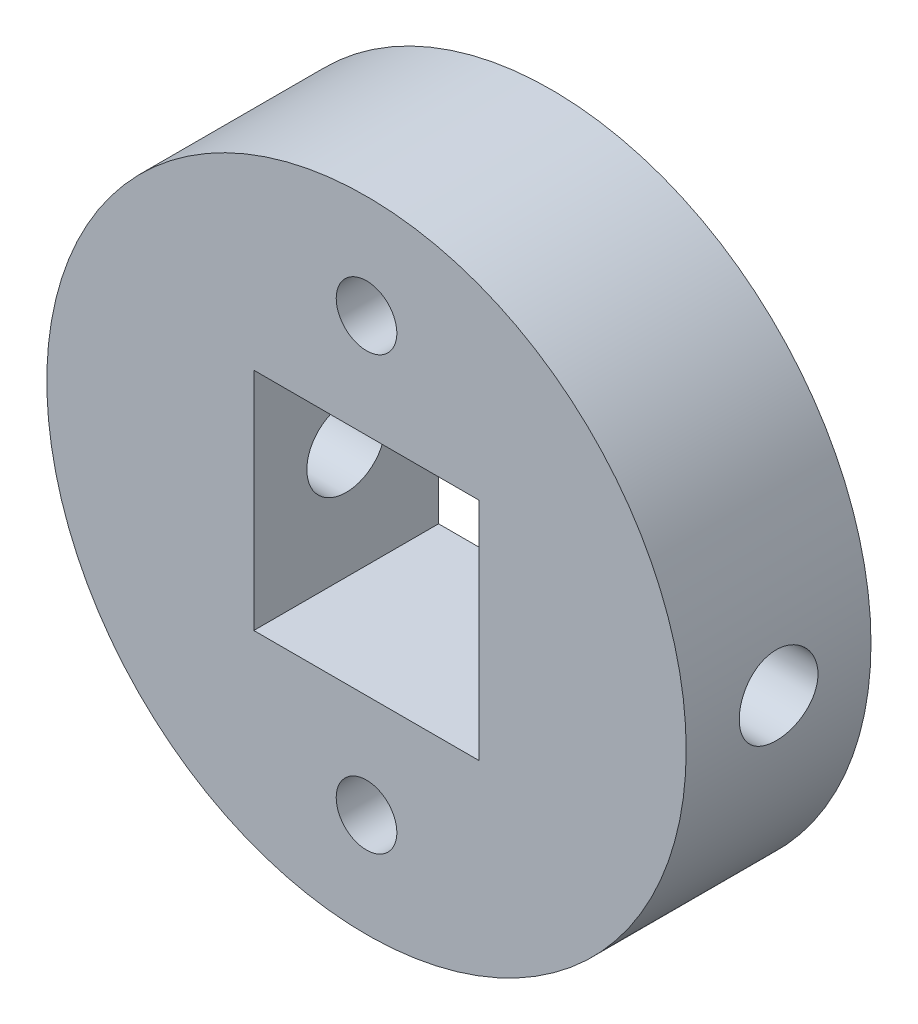
ISO-10303-21;
HEADER;
FILE_DESCRIPTION(('STEP AP214'),'2;1');
FILE_NAME('part.step','',(''),(''),'','','');
FILE_SCHEMA(('AUTOMOTIVE_DESIGN { 1 0 10303 214 1 1 1 1 }'));
ENDSEC;
DATA;
#1=APPLICATION_CONTEXT('core data for automotive mechanical design processes');
#2=APPLICATION_PROTOCOL_DEFINITION('international standard','automotive_design',2000,#1);
#3=PRODUCT_CONTEXT('',#1,'mechanical');
#4=PRODUCT('Part','Part','',(#3));
#5=PRODUCT_RELATED_PRODUCT_CATEGORY('part','',(#4));
#6=PRODUCT_DEFINITION_FORMATION('','',#4);
#7=PRODUCT_DEFINITION_CONTEXT('part definition',#1,'design');
#8=PRODUCT_DEFINITION('design','',#6,#7);
#9=PRODUCT_DEFINITION_SHAPE('','',#8);
#10=(LENGTH_UNIT() NAMED_UNIT(*) SI_UNIT(.MILLI.,.METRE.));
#11=(NAMED_UNIT(*) PLANE_ANGLE_UNIT() SI_UNIT($,.RADIAN.));
#12=(NAMED_UNIT(*) SI_UNIT($,.STERADIAN.) SOLID_ANGLE_UNIT());
#13=UNCERTAINTY_MEASURE_WITH_UNIT(LENGTH_MEASURE(1.E-05),#10,'distance_accuracy_value','');
#14=(GEOMETRIC_REPRESENTATION_CONTEXT(3) GLOBAL_UNCERTAINTY_ASSIGNED_CONTEXT((#13)) GLOBAL_UNIT_ASSIGNED_CONTEXT((#10,
#11,#12)) REPRESENTATION_CONTEXT('',''));
#15=CARTESIAN_POINT('',(0.,0.,0.));
#16=DIRECTION('',(0.,0.,1.));
#17=DIRECTION('',(1.,0.,0.));
#18=AXIS2_PLACEMENT_3D('',#15,#16,#17);
#19=CARTESIAN_POINT('',(0.,0.,6.35));
#20=DIRECTION('',(0.,0.,1.));
#21=DIRECTION('',(1.,0.,0.));
#22=AXIS2_PLACEMENT_3D('',#19,#20,#21);
#23=PLANE('',#22);
#24=CARTESIAN_POINT('',(0.,-7.4295,6.35));
#25=DIRECTION('',(0.,0.,-1.));
#26=DIRECTION('',(-1.,0.,0.));
#27=AXIS2_PLACEMENT_3D('',#24,#25,#26);
#28=CIRCLE('',#27,1.0414);
#29=CARTESIAN_POINT('',(-1.0414,-7.4295,6.35));
#30=VERTEX_POINT('',#29);
#31=EDGE_CURVE('E188',#30,#30,#28,.T.);
#32=ORIENTED_EDGE('',*,*,#31,.T.);
#33=EDGE_LOOP('',(#32));
#34=FACE_BOUND('',#33,.T.);
#35=CARTESIAN_POINT('',(0.,7.4295,6.35));
#36=DIRECTION('',(0.,0.,-1.));
#37=DIRECTION('',(-1.,0.,0.));
#38=AXIS2_PLACEMENT_3D('',#35,#36,#37);
#39=CIRCLE('',#38,1.0414);
#40=CARTESIAN_POINT('',(-1.0414,7.4295,6.35));
#41=VERTEX_POINT('',#40);
#42=EDGE_CURVE('E187',#41,#41,#39,.T.);
#43=ORIENTED_EDGE('',*,*,#42,.T.);
#44=EDGE_LOOP('',(#43));
#45=FACE_BOUND('',#44,.T.);
#46=CARTESIAN_POINT('',(0.,0.,6.35));
#47=DIRECTION('',(0.,0.,1.));
#48=DIRECTION('',(1.,0.,0.));
#49=AXIS2_PLACEMENT_3D('',#46,#47,#48);
#50=CIRCLE('',#49,10.9855);
#51=CARTESIAN_POINT('',(10.9855,0.,6.35));
#52=VERTEX_POINT('',#51);
#53=EDGE_CURVE('E134',#52,#52,#50,.T.);
#54=ORIENTED_EDGE('',*,*,#53,.T.);
#55=EDGE_LOOP('',(#54));
#56=FACE_BOUND('',#55,.T.);
#57=DIRECTION('',(-1.,0.,0.));
#58=VECTOR('',#57,1.);
#59=CARTESIAN_POINT('',(-3.8735,3.8735,6.35));
#60=LINE('',#59,#58);
#61=CARTESIAN_POINT('',(3.8735,3.8735,6.35));
#62=VERTEX_POINT('',#61);
#63=CARTESIAN_POINT('',(-3.8735,3.8735,6.35));
#64=VERTEX_POINT('',#63);
#65=EDGE_CURVE('E93',#62,#64,#60,.T.);
#66=ORIENTED_EDGE('',*,*,#65,.F.);
#67=DIRECTION('',(0.,1.,0.));
#68=VECTOR('',#67,1.);
#69=CARTESIAN_POINT('',(3.8735,-3.8735,6.35));
#70=LINE('',#69,#68);
#71=CARTESIAN_POINT('',(3.8735,-3.8735,6.35));
#72=VERTEX_POINT('',#71);
#73=EDGE_CURVE('E85',#72,#62,#70,.T.);
#74=ORIENTED_EDGE('',*,*,#73,.F.);
#75=DIRECTION('',(1.,0.,0.));
#76=VECTOR('',#75,1.);
#77=CARTESIAN_POINT('',(-3.8735,-3.8735,6.35));
#78=LINE('',#77,#76);
#79=CARTESIAN_POINT('',(-3.8735,-3.8735,6.35));
#80=VERTEX_POINT('',#79);
#81=EDGE_CURVE('E107',#80,#72,#78,.T.);
#82=ORIENTED_EDGE('',*,*,#81,.F.);
#83=DIRECTION('',(0.,-1.,0.));
#84=VECTOR('',#83,1.);
#85=CARTESIAN_POINT('',(-3.8735,-3.8735,6.35));
#86=LINE('',#85,#84);
#87=EDGE_CURVE('E105',#64,#80,#86,.T.);
#88=ORIENTED_EDGE('',*,*,#87,.F.);
#89=EDGE_LOOP('',(#66,#74,#82,#88));
#90=FACE_BOUND('',#89,.T.);
#91=ADVANCED_FACE('F40',(#34,#45,#56,#90),#23,.T.);
#92=CARTESIAN_POINT('',(0.,0.,0.));
#93=DIRECTION('',(0.,0.,1.));
#94=DIRECTION('',(1.,0.,0.));
#95=AXIS2_PLACEMENT_3D('',#92,#93,#94);
#96=PLANE('',#95);
#97=CARTESIAN_POINT('',(0.,-7.4295,0.));
#98=DIRECTION('',(0.,0.,-1.));
#99=DIRECTION('',(-1.,0.,0.));
#100=AXIS2_PLACEMENT_3D('',#97,#98,#99);
#101=CIRCLE('',#100,1.0414);
#102=CARTESIAN_POINT('',(-1.0414,-7.4295,0.));
#103=VERTEX_POINT('',#102);
#104=EDGE_CURVE('E175',#103,#103,#101,.T.);
#105=ORIENTED_EDGE('',*,*,#104,.F.);
#106=EDGE_LOOP('',(#105));
#107=FACE_BOUND('',#106,.T.);
#108=CARTESIAN_POINT('',(0.,7.4295,0.));
#109=DIRECTION('',(0.,0.,-1.));
#110=DIRECTION('',(-1.,0.,0.));
#111=AXIS2_PLACEMENT_3D('',#108,#109,#110);
#112=CIRCLE('',#111,1.0414);
#113=CARTESIAN_POINT('',(-1.0414,7.4295,0.));
#114=VERTEX_POINT('',#113);
#115=EDGE_CURVE('E179',#114,#114,#112,.T.);
#116=ORIENTED_EDGE('',*,*,#115,.F.);
#117=EDGE_LOOP('',(#116));
#118=FACE_BOUND('',#117,.T.);
#119=CARTESIAN_POINT('',(0.,0.,0.));
#120=DIRECTION('',(0.,0.,1.));
#121=DIRECTION('',(1.,0.,0.));
#122=AXIS2_PLACEMENT_3D('',#119,#120,#121);
#123=CIRCLE('',#122,10.9855);
#124=CARTESIAN_POINT('',(10.9855,0.,0.));
#125=VERTEX_POINT('',#124);
#126=EDGE_CURVE('E101',#125,#125,#123,.T.);
#127=ORIENTED_EDGE('',*,*,#126,.F.);
#128=EDGE_LOOP('',(#127));
#129=FACE_BOUND('',#128,.T.);
#130=DIRECTION('',(0.,1.,0.));
#131=VECTOR('',#130,1.);
#132=CARTESIAN_POINT('',(3.8735,-3.8735,0.));
#133=LINE('',#132,#131);
#134=CARTESIAN_POINT('',(3.8735,-3.8735,0.));
#135=VERTEX_POINT('',#134);
#136=CARTESIAN_POINT('',(3.8735,3.8735,0.));
#137=VERTEX_POINT('',#136);
#138=EDGE_CURVE('E67',#135,#137,#133,.T.);
#139=ORIENTED_EDGE('',*,*,#138,.T.);
#140=DIRECTION('',(-1.,0.,0.));
#141=VECTOR('',#140,1.);
#142=CARTESIAN_POINT('',(-3.8735,3.8735,0.));
#143=LINE('',#142,#141);
#144=CARTESIAN_POINT('',(-3.8735,3.8735,0.));
#145=VERTEX_POINT('',#144);
#146=EDGE_CURVE('E100',#137,#145,#143,.T.);
#147=ORIENTED_EDGE('',*,*,#146,.T.);
#148=DIRECTION('',(0.,-1.,0.));
#149=VECTOR('',#148,1.);
#150=CARTESIAN_POINT('',(-3.8735,-3.8735,0.));
#151=LINE('',#150,#149);
#152=CARTESIAN_POINT('',(-3.8735,-3.8735,0.));
#153=VERTEX_POINT('',#152);
#154=EDGE_CURVE('E123',#145,#153,#151,.T.);
#155=ORIENTED_EDGE('',*,*,#154,.T.);
#156=DIRECTION('',(1.,0.,0.));
#157=VECTOR('',#156,1.);
#158=CARTESIAN_POINT('',(-3.8735,-3.8735,0.));
#159=LINE('',#158,#157);
#160=EDGE_CURVE('E94',#153,#135,#159,.T.);
#161=ORIENTED_EDGE('',*,*,#160,.T.);
#162=EDGE_LOOP('',(#139,#147,#155,#161));
#163=FACE_BOUND('',#162,.T.);
#164=ADVANCED_FACE('F164',(#107,#118,#129,#163),#96,.F.);
#165=CARTESIAN_POINT('',(0.,0.,6.35));
#166=DIRECTION('',(0.,0.,-1.));
#167=DIRECTION('',(-1.,0.,0.));
#168=AXIS2_PLACEMENT_3D('',#165,#166,#167);
#169=CYLINDRICAL_SURFACE('',#168,10.9855);
#170=CARTESIAN_POINT('',(-10.9855,0.,1.82245000000001));
#171=CARTESIAN_POINT('',(-10.985498957363,0.0756662162892515,1.82245322021186));
#172=CARTESIAN_POINT('',(-10.984709975864,0.151379942554252,1.82882094142912));
#173=CARTESIAN_POINT('',(-10.9816384618443,0.300701184764233,1.85412287565918));
#174=CARTESIAN_POINT('',(-10.9793543627383,0.374306406888228,1.87307026996058));
#175=CARTESIAN_POINT('',(-10.9735499724927,0.517227243019656,1.92296540642161));
#176=CARTESIAN_POINT('',(-10.9700305065537,0.586545684246488,1.95390513937142));
#177=CARTESIAN_POINT('',(-10.9621469922232,0.71899296324033,2.02688932930371));
#178=CARTESIAN_POINT('',(-10.9577830906441,0.782122874066539,2.06893185643231));
#179=CARTESIAN_POINT('',(-10.9486719690168,0.900752004222969,2.16316864625308));
#180=CARTESIAN_POINT('',(-10.9439230188851,0.956213365972777,2.21541040312885));
#181=CARTESIAN_POINT('',(-10.9345910150808,1.05760506470752,2.32846077026844));
#182=CARTESIAN_POINT('',(-10.9300079698058,1.1035349197966,2.38926981341804));
#183=CARTESIAN_POINT('',(-10.9215096106737,1.18470031478497,2.51797394252124));
#184=CARTESIAN_POINT('',(-10.9175965239231,1.21990047795271,2.58589149801702));
#185=CARTESIAN_POINT('',(-10.9109038561484,1.27838136450854,2.72673014975643));
#186=CARTESIAN_POINT('',(-10.9081242333961,1.30166252669949,2.79965106168735));
#187=CARTESIAN_POINT('',(-10.9040296732988,1.33552971643817,2.94803404313264));
#188=CARTESIAN_POINT('',(-10.9027073727078,1.34617958568991,3.02348133458864));
#189=CARTESIAN_POINT('',(-10.9016546151378,1.35467941015745,3.17510303021034));
#190=CARTESIAN_POINT('',(-10.9019240959895,1.35252986527228,3.25127740586274));
#191=CARTESIAN_POINT('',(-10.904017715658,1.33554430280861,3.40174643573768));
#192=CARTESIAN_POINT('',(-10.905833242709,1.32077855829166,3.47604915951025));
#193=CARTESIAN_POINT('',(-10.9108009572682,1.27908936011294,3.62111402003232));
#194=CARTESIAN_POINT('',(-10.9139531711192,1.25216566684779,3.69187608697361));
#195=CARTESIAN_POINT('',(-10.9212488607713,1.18684913528334,3.82806957290694));
#196=CARTESIAN_POINT('',(-10.9253949745184,1.14842570650951,3.893486174053));
#197=CARTESIAN_POINT('',(-10.9342092467618,1.06122229554948,4.01696943795403));
#198=CARTESIAN_POINT('',(-10.9388774284228,1.01244185372596,4.07503577432654));
#199=CARTESIAN_POINT('',(-10.9482481397586,0.905519407597169,4.18257814431771));
#200=CARTESIAN_POINT('',(-10.9529506898525,0.847316821845073,4.2319939638781));
#201=CARTESIAN_POINT('',(-10.9618309693402,0.723410981534479,4.32036390388339));
#202=CARTESIAN_POINT('',(-10.9660086975844,0.657707710547477,4.35931800141369));
#203=CARTESIAN_POINT('',(-10.973371100294,0.520619528099018,4.4256585752767));
#204=CARTESIAN_POINT('',(-10.9765554560804,0.449232802556392,4.45304134046406));
#205=CARTESIAN_POINT('',(-10.9815694072985,0.302826693394582,4.49541445569743));
#206=CARTESIAN_POINT('',(-10.9833990642513,0.227807474903285,4.51040536850035));
#207=CARTESIAN_POINT('',(-10.9854894761024,0.076786607145977,4.52749133655337));
#208=CARTESIAN_POINT('',(-10.9857603235799,0.000794477815036689,4.52966935150521));
#209=CARTESIAN_POINT('',(-10.98472983342,-0.150471667753615,4.52128654388073));
#210=CARTESIAN_POINT('',(-10.983428528243,-0.225745698785651,4.51072598431938));
#211=CARTESIAN_POINT('',(-10.9794062526405,-0.37319454870657,4.47723471389979));
#212=CARTESIAN_POINT('',(-10.9766898160552,-0.445378473165177,4.45434350044147));
#213=CARTESIAN_POINT('',(-10.9701414522363,-0.584882795940893,4.39688174479581));
#214=CARTESIAN_POINT('',(-10.9663094881588,-0.652203033527449,4.36231081684235));
#215=CARTESIAN_POINT('',(-10.9579322413848,-0.780439889706667,4.28226984364084));
#216=CARTESIAN_POINT('',(-10.9533834813827,-0.841322738919962,4.23674606527089));
#217=CARTESIAN_POINT('',(-10.9440925211964,-0.954613150762994,4.13616774658086));
#218=CARTESIAN_POINT('',(-10.9393503135765,-1.00702038722132,4.08111283963814));
#219=CARTESIAN_POINT('',(-10.9301758586455,-1.10216574586961,3.96266991982286));
#220=CARTESIAN_POINT('',(-10.9257454660101,-1.1448489203689,3.89923760285575));
#221=CARTESIAN_POINT('',(-10.9177265933334,-1.21895508987927,3.76605575269222));
#222=CARTESIAN_POINT('',(-10.9141380968412,-1.25037830491825,3.69630634296981));
#223=CARTESIAN_POINT('',(-10.9082218729706,-1.30098335677853,3.55264845034915));
#224=CARTESIAN_POINT('',(-10.9058909426587,-1.32019631472361,3.47875106772464));
#225=CARTESIAN_POINT('',(-10.9027445215885,-1.3459357523905,3.3287484522286));
#226=CARTESIAN_POINT('',(-10.9019289626019,-1.35246280328493,3.25264331891585));
#227=CARTESIAN_POINT('',(-10.9019075696062,-1.35263488131563,3.10093215651525));
#228=CARTESIAN_POINT('',(-10.9026909487184,-1.34636623176684,3.02532621231655));
#229=CARTESIAN_POINT('',(-10.9057559894638,-1.32130750279951,2.87625115678073));
#230=CARTESIAN_POINT('',(-10.908037651404,-1.30251742081543,2.80278204588143));
#231=CARTESIAN_POINT('',(-10.9138388641635,-1.25297594495023,2.66007666440372));
#232=CARTESIAN_POINT('',(-10.9173579981753,-1.22222857817304,2.59083897779543));
#233=CARTESIAN_POINT('',(-10.9252383394411,-1.14965384729889,2.45849205211765));
#234=CARTESIAN_POINT('',(-10.9295995560004,-1.10782636076196,2.39538288078137));
#235=CARTESIAN_POINT('',(-10.9387079192267,-1.01395807244356,2.27664302261158));
#236=CARTESIAN_POINT('',(-10.94345738093,-0.961852922869473,2.22106337931411));
#237=CARTESIAN_POINT('',(-10.9527865819289,-0.849042246881335,2.11940316882315));
#238=CARTESIAN_POINT('',(-10.9573662808957,-0.788334693191169,2.07332484705058));
#239=CARTESIAN_POINT('',(-10.9658585550583,-0.659786097634867,1.99183111491038));
#240=CARTESIAN_POINT('',(-10.9697686043229,-0.591919541801462,1.95645570771185));
#241=CARTESIAN_POINT('',(-10.9764553067321,-0.451199383169794,1.89765388229206));
#242=CARTESIAN_POINT('',(-10.9792331945981,-0.378351314986264,1.8742144398554));
#243=CARTESIAN_POINT('',(-10.9826705918215,-0.254269465037126,1.84557997558929));
#244=CARTESIAN_POINT('',(-10.9837264691404,-0.20381908395256,1.83691864942233));
#245=CARTESIAN_POINT('',(-10.9851415230865,-0.102253032067665,1.82535259383982));
#246=CARTESIAN_POINT('',(-10.9855007046435,-0.0511373659775836,1.82244782368989));
#247=CARTESIAN_POINT('',(-10.9855,0.,1.82245000000001));
#248=B_SPLINE_CURVE_WITH_KNOTS('',3,(#170,#171,#172,#173,#174,#175,#176,#177,#178,#179,#180,
#181,#182,#183,#184,#185,#186,#187,#188,#189,#190,#191,#192,#193,#194,#195,#196,#197,#198,#199,
#200,#201,#202,#203,#204,#205,#206,#207,#208,#209,#210,#211,#212,#213,#214,#215,#216,#217,#218,
#219,#220,#221,#222,#223,#224,#225,#226,#227,#228,#229,#230,#231,#232,#233,#234,#235,#236,#237,
#238,#239,#240,#241,#242,#243,#244,#245,#246,#247),.UNSPECIFIED.,.T.,.F.,(4,2,2,2,2,2,2,2,2,2,2,
2,2,2,2,2,2,2,2,2,2,2,2,2,2,2,2,2,2,2,2,2,2,2,2,2,2,2,4),(0.,0.226811864735638,
0.453861764353082,0.680760286857207,0.907619396479579,1.13556125211483,1.36351462927464,
1.59221165570891,1.82090026196349,2.0484280254365,2.27594690255271,2.50220668498508,
2.72847092663824,2.95534248636422,3.18222411660358,3.41062712350764,3.63903063068491,
3.86750733569655,4.0959736642199,4.32295909889393,4.54993984705094,4.77619781958037,
5.00246326585366,5.22986222220812,5.45726992759339,5.68593242000035,5.91459044393052,
6.14266330905155,6.37072590514026,6.59725501387006,6.82378416901388,7.05023709719496,
7.27669252788045,7.50461356020783,7.73258839490117,7.96140507041502,8.18997152919245,
8.343258477822,8.496544341763),.UNSPECIFIED.);
#249=CARTESIAN_POINT('',(-10.9855,0.,1.82245000000001));
#250=VERTEX_POINT('',#249);
#251=EDGE_CURVE('E12',#250,#250,#248,.T.);
#252=ORIENTED_EDGE('',*,*,#251,.T.);
#253=EDGE_LOOP('',(#252));
#254=FACE_BOUND('',#253,.T.);
#255=CARTESIAN_POINT('',(10.9855,0.,4.52754999999999));
#256=CARTESIAN_POINT('',(10.985498957363,0.0756662162892515,4.52754677978814));
#257=CARTESIAN_POINT('',(10.984709975864,0.151379942554252,4.52117905857088));
#258=CARTESIAN_POINT('',(10.9816384618443,0.300701184764233,4.49587712434082));
#259=CARTESIAN_POINT('',(10.9793543627383,0.374306406888228,4.47692973003942));
#260=CARTESIAN_POINT('',(10.9735499724927,0.517227243019656,4.42703459357839));
#261=CARTESIAN_POINT('',(10.9700305065537,0.586545684246487,4.39609486062858));
#262=CARTESIAN_POINT('',(10.9621469922232,0.71899296324033,4.3231106706963));
#263=CARTESIAN_POINT('',(10.9577830906441,0.782122874066539,4.28106814356769));
#264=CARTESIAN_POINT('',(10.9486719690168,0.900752004222968,4.18683135374692));
#265=CARTESIAN_POINT('',(10.9439230188851,0.956213365972777,4.13458959687115));
#266=CARTESIAN_POINT('',(10.9345910150808,1.05760506470752,4.02153922973156));
#267=CARTESIAN_POINT('',(10.9300079698058,1.1035349197966,3.96073018658196));
#268=CARTESIAN_POINT('',(10.9215096106737,1.18470031478497,3.83202605747876));
#269=CARTESIAN_POINT('',(10.9175965239231,1.21990047795271,3.76410850198298));
#270=CARTESIAN_POINT('',(10.9109038561484,1.27838136450854,3.62326985024357));
#271=CARTESIAN_POINT('',(10.9081242333961,1.30166252669949,3.55034893831265));
#272=CARTESIAN_POINT('',(10.9040296732988,1.33552971643817,3.40196595686736));
#273=CARTESIAN_POINT('',(10.9027073727078,1.34617958568991,3.32651866541137));
#274=CARTESIAN_POINT('',(10.9016546151378,1.35467941015745,3.17489696978967));
#275=CARTESIAN_POINT('',(10.9019240959895,1.35252986527228,3.09872259413726));
#276=CARTESIAN_POINT('',(10.904017715658,1.33554430280861,2.94825356426232));
#277=CARTESIAN_POINT('',(10.905833242709,1.32077855829166,2.87395084048975));
#278=CARTESIAN_POINT('',(10.9108009572682,1.27908936011294,2.72888597996768));
#279=CARTESIAN_POINT('',(10.9139531711192,1.25216566684779,2.65812391302639));
#280=CARTESIAN_POINT('',(10.9212488607713,1.18684913528334,2.52193042709307));
#281=CARTESIAN_POINT('',(10.9253949745184,1.14842570650951,2.456513825947));
#282=CARTESIAN_POINT('',(10.9342092467618,1.06122229554948,2.33303056204598));
#283=CARTESIAN_POINT('',(10.9388774284228,1.01244185372596,2.27496422567346));
#284=CARTESIAN_POINT('',(10.9482481397586,0.905519407597169,2.16742185568229));
#285=CARTESIAN_POINT('',(10.9529506898525,0.847316821845073,2.1180060361219));
#286=CARTESIAN_POINT('',(10.9618309693402,0.723410981534479,2.02963609611661));
#287=CARTESIAN_POINT('',(10.9660086975844,0.657707710547477,1.99068199858631));
#288=CARTESIAN_POINT('',(10.973371100294,0.520619528099018,1.9243414247233));
#289=CARTESIAN_POINT('',(10.9765554560804,0.449232802556392,1.89695865953594));
#290=CARTESIAN_POINT('',(10.9815694072985,0.302826693394583,1.85458554430258));
#291=CARTESIAN_POINT('',(10.9833990642513,0.227807474903286,1.83959463149966));
#292=CARTESIAN_POINT('',(10.9854894761024,0.0767866071459776,1.82250866344663));
#293=CARTESIAN_POINT('',(10.9857603235799,0.000794477815037326,1.82033064849479));
#294=CARTESIAN_POINT('',(10.98472983342,-0.150471667753615,1.82871345611927));
#295=CARTESIAN_POINT('',(10.983428528243,-0.225745698785651,1.83927401568062));
#296=CARTESIAN_POINT('',(10.9794062526405,-0.37319454870657,1.87276528610021));
#297=CARTESIAN_POINT('',(10.9766898160552,-0.445378473165177,1.89565649955853));
#298=CARTESIAN_POINT('',(10.9701414522363,-0.584882795940893,1.95311825520419));
#299=CARTESIAN_POINT('',(10.9663094881588,-0.652203033527449,1.98768918315765));
#300=CARTESIAN_POINT('',(10.9579322413848,-0.780439889706667,2.06773015635916));
#301=CARTESIAN_POINT('',(10.9533834813827,-0.841322738919962,2.11325393472911));
#302=CARTESIAN_POINT('',(10.9440925211964,-0.954613150762994,2.21383225341914));
#303=CARTESIAN_POINT('',(10.9393503135765,-1.00702038722132,2.26888716036186));
#304=CARTESIAN_POINT('',(10.9301758586455,-1.10216574586961,2.38733008017714));
#305=CARTESIAN_POINT('',(10.9257454660101,-1.14484892036889,2.45076239714426));
#306=CARTESIAN_POINT('',(10.9177265933334,-1.21895508987927,2.58394424730778));
#307=CARTESIAN_POINT('',(10.9141380968412,-1.25037830491825,2.65369365703019));
#308=CARTESIAN_POINT('',(10.9082218729706,-1.30098335677853,2.79735154965085));
#309=CARTESIAN_POINT('',(10.9058909426587,-1.32019631472361,2.87124893227536));
#310=CARTESIAN_POINT('',(10.9027445215885,-1.3459357523905,3.0212515477714));
#311=CARTESIAN_POINT('',(10.9019289626019,-1.35246280328493,3.09735668108415));
#312=CARTESIAN_POINT('',(10.9019075696062,-1.35263488131563,3.24906784348475));
#313=CARTESIAN_POINT('',(10.9026909487184,-1.34636623176684,3.32467378768345));
#314=CARTESIAN_POINT('',(10.9057559894638,-1.32130750279951,3.47374884321927));
#315=CARTESIAN_POINT('',(10.908037651404,-1.30251742081543,3.54721795411858));
#316=CARTESIAN_POINT('',(10.9138388641635,-1.25297594495023,3.68992333559628));
#317=CARTESIAN_POINT('',(10.9173579981753,-1.22222857817304,3.75916102220457));
#318=CARTESIAN_POINT('',(10.9252383394411,-1.14965384729889,3.89150794788235));
#319=CARTESIAN_POINT('',(10.9295995560004,-1.10782636076196,3.95461711921863));
#320=CARTESIAN_POINT('',(10.9387079192267,-1.01395807244356,4.07335697738842));
#321=CARTESIAN_POINT('',(10.94345738093,-0.961852922869475,4.12893662068589));
#322=CARTESIAN_POINT('',(10.9527865819289,-0.849042246881336,4.23059683117685));
#323=CARTESIAN_POINT('',(10.9573662808957,-0.78833469319117,4.27667515294942));
#324=CARTESIAN_POINT('',(10.9658585550583,-0.659786097634868,4.35816888508962));
#325=CARTESIAN_POINT('',(10.9697686043229,-0.591919541801463,4.39354429228815));
#326=CARTESIAN_POINT('',(10.9764553067321,-0.451199383169796,4.45234611770794));
#327=CARTESIAN_POINT('',(10.9792331945981,-0.378351314986264,4.4757855601446));
#328=CARTESIAN_POINT('',(10.9826705918215,-0.254269465037126,4.50442002441071));
#329=CARTESIAN_POINT('',(10.9837264691404,-0.20381908395256,4.51308135057767));
#330=CARTESIAN_POINT('',(10.9851415230865,-0.102253032067665,4.52464740616018));
#331=CARTESIAN_POINT('',(10.9855007046435,-0.0511373659775832,4.52755217631011));
#332=CARTESIAN_POINT('',(10.9855,0.,4.52754999999999));
#333=B_SPLINE_CURVE_WITH_KNOTS('',3,(#255,#256,#257,#258,#259,#260,#261,#262,#263,#264,#265,
#266,#267,#268,#269,#270,#271,#272,#273,#274,#275,#276,#277,#278,#279,#280,#281,#282,#283,#284,
#285,#286,#287,#288,#289,#290,#291,#292,#293,#294,#295,#296,#297,#298,#299,#300,#301,#302,#303,
#304,#305,#306,#307,#308,#309,#310,#311,#312,#313,#314,#315,#316,#317,#318,#319,#320,#321,#322,
#323,#324,#325,#326,#327,#328,#329,#330,#331,#332),.UNSPECIFIED.,.T.,.F.,(4,2,2,2,2,2,2,2,2,2,2,
2,2,2,2,2,2,2,2,2,2,2,2,2,2,2,2,2,2,2,2,2,2,2,2,2,2,2,4),(0.,0.226811864735638,
0.453861764353082,0.680760286857207,0.907619396479578,1.13556125211483,1.36351462927464,
1.59221165570891,1.82090026196349,2.0484280254365,2.27594690255271,2.50220668498508,
2.72847092663824,2.95534248636422,3.18222411660358,3.41062712350764,3.63903063068491,
3.86750733569655,4.0959736642199,4.32295909889393,4.54993984705094,4.77619781958037,
5.00246326585366,5.22986222220811,5.45726992759339,5.68593242000035,5.91459044393052,
6.14266330905155,6.37072590514025,6.59725501387005,6.82378416901388,7.05023709719496,
7.27669252788044,7.50461356020782,7.73258839490117,7.96140507041502,8.18997152919245,
8.343258477822,8.49654434176299),.UNSPECIFIED.);
#334=CARTESIAN_POINT('',(10.9855,0.,4.52754999999999));
#335=VERTEX_POINT('',#334);
#336=EDGE_CURVE('E52',#335,#335,#333,.T.);
#337=ORIENTED_EDGE('',*,*,#336,.T.);
#338=EDGE_LOOP('',(#337));
#339=FACE_BOUND('',#338,.T.);
#340=ORIENTED_EDGE('',*,*,#53,.F.);
#341=EDGE_LOOP('',(#340));
#342=FACE_BOUND('',#341,.T.);
#343=ORIENTED_EDGE('',*,*,#126,.T.);
#344=EDGE_LOOP('',(#343));
#345=FACE_BOUND('',#344,.T.);
#346=ADVANCED_FACE('F42',(#254,#339,#342,#345),#169,.T.);
#347=CARTESIAN_POINT('',(3.8735,-3.8735,6.35));
#348=DIRECTION('',(-1.,0.,0.));
#349=DIRECTION('',(0.,0.,1.));
#350=AXIS2_PLACEMENT_3D('',#347,#348,#349);
#351=PLANE('',#350);
#352=CARTESIAN_POINT('',(3.8735,0.,3.175));
#353=DIRECTION('',(-1.,0.,0.));
#354=DIRECTION('',(0.,0.,1.));
#355=AXIS2_PLACEMENT_3D('',#352,#353,#354);
#356=CIRCLE('',#355,1.35254999999999);
#357=CARTESIAN_POINT('',(3.8735,0.,4.52754999999999));
#358=VERTEX_POINT('',#357);
#359=EDGE_CURVE('E115',#358,#358,#356,.T.);
#360=ORIENTED_EDGE('',*,*,#359,.F.);
#361=EDGE_LOOP('',(#360));
#362=FACE_BOUND('',#361,.T.);
#363=ORIENTED_EDGE('',*,*,#138,.F.);
#364=DIRECTION('',(0.,0.,-1.));
#365=VECTOR('',#364,1.);
#366=CARTESIAN_POINT('',(3.8735,-3.8735,6.35));
#367=LINE('',#366,#365);
#368=EDGE_CURVE('E89',#72,#135,#367,.T.);
#369=ORIENTED_EDGE('',*,*,#368,.F.);
#370=ORIENTED_EDGE('',*,*,#73,.T.);
#371=DIRECTION('',(0.,0.,-1.));
#372=VECTOR('',#371,1.);
#373=CARTESIAN_POINT('',(3.8735,3.8735,6.35));
#374=LINE('',#373,#372);
#375=EDGE_CURVE('E88',#62,#137,#374,.T.);
#376=ORIENTED_EDGE('',*,*,#375,.T.);
#377=EDGE_LOOP('',(#363,#369,#370,#376));
#378=FACE_BOUND('',#377,.T.);
#379=ADVANCED_FACE('F87',(#362,#378),#351,.T.);
#380=CARTESIAN_POINT('',(-3.8735,3.8735,6.35));
#381=DIRECTION('',(0.,-1.,0.));
#382=DIRECTION('',(0.,0.,-1.));
#383=AXIS2_PLACEMENT_3D('',#380,#381,#382);
#384=PLANE('',#383);
#385=ORIENTED_EDGE('',*,*,#146,.F.);
#386=ORIENTED_EDGE('',*,*,#375,.F.);
#387=ORIENTED_EDGE('',*,*,#65,.T.);
#388=DIRECTION('',(0.,0.,-1.));
#389=VECTOR('',#388,1.);
#390=CARTESIAN_POINT('',(-3.8735,3.8735,6.35));
#391=LINE('',#390,#389);
#392=EDGE_CURVE('E102',#64,#145,#391,.T.);
#393=ORIENTED_EDGE('',*,*,#392,.T.);
#394=EDGE_LOOP('',(#385,#386,#387,#393));
#395=FACE_BOUND('',#394,.T.);
#396=ADVANCED_FACE('F97',(#395),#384,.T.);
#397=CARTESIAN_POINT('',(-3.8735,-3.8735,6.35));
#398=DIRECTION('',(1.,0.,0.));
#399=DIRECTION('',(0.,0.,-1.));
#400=AXIS2_PLACEMENT_3D('',#397,#398,#399);
#401=PLANE('',#400);
#402=CARTESIAN_POINT('',(-3.8735,0.,3.175));
#403=DIRECTION('',(1.,0.,0.));
#404=DIRECTION('',(0.,0.,-1.));
#405=AXIS2_PLACEMENT_3D('',#402,#403,#404);
#406=CIRCLE('',#405,1.35254999999999);
#407=CARTESIAN_POINT('',(-3.8735,0.,1.82245000000001));
#408=VERTEX_POINT('',#407);
#409=EDGE_CURVE('E200',#408,#408,#406,.T.);
#410=ORIENTED_EDGE('',*,*,#409,.F.);
#411=EDGE_LOOP('',(#410));
#412=FACE_BOUND('',#411,.T.);
#413=ORIENTED_EDGE('',*,*,#154,.F.);
#414=ORIENTED_EDGE('',*,*,#392,.F.);
#415=ORIENTED_EDGE('',*,*,#87,.T.);
#416=DIRECTION('',(0.,0.,-1.));
#417=VECTOR('',#416,1.);
#418=CARTESIAN_POINT('',(-3.8735,-3.8735,6.35));
#419=LINE('',#418,#417);
#420=EDGE_CURVE('E59',#80,#153,#419,.T.);
#421=ORIENTED_EDGE('',*,*,#420,.T.);
#422=EDGE_LOOP('',(#413,#414,#415,#421));
#423=FACE_BOUND('',#422,.T.);
#424=ADVANCED_FACE('F154',(#412,#423),#401,.T.);
#425=CARTESIAN_POINT('',(-3.8735,-3.8735,6.35));
#426=DIRECTION('',(0.,1.,0.));
#427=DIRECTION('',(0.,0.,1.));
#428=AXIS2_PLACEMENT_3D('',#425,#426,#427);
#429=PLANE('',#428);
#430=ORIENTED_EDGE('',*,*,#160,.F.);
#431=ORIENTED_EDGE('',*,*,#420,.F.);
#432=ORIENTED_EDGE('',*,*,#81,.T.);
#433=ORIENTED_EDGE('',*,*,#368,.T.);
#434=EDGE_LOOP('',(#430,#431,#432,#433));
#435=FACE_BOUND('',#434,.T.);
#436=ADVANCED_FACE('F148',(#435),#429,.T.);
#437=CARTESIAN_POINT('',(3.8735,0.,3.175));
#438=DIRECTION('',(-1.,0.,0.));
#439=DIRECTION('',(0.,0.,1.));
#440=AXIS2_PLACEMENT_3D('',#437,#438,#439);
#441=CYLINDRICAL_SURFACE('',#440,1.35254999999999);
#442=ORIENTED_EDGE('',*,*,#359,.T.);
#443=EDGE_LOOP('',(#442));
#444=FACE_BOUND('',#443,.T.);
#445=ORIENTED_EDGE('',*,*,#336,.F.);
#446=EDGE_LOOP('',(#445));
#447=FACE_BOUND('',#446,.T.);
#448=ADVANCED_FACE('F143',(#444,#447),#441,.F.);
#449=CARTESIAN_POINT('',(-3.8735,0.,3.175));
#450=DIRECTION('',(1.,0.,0.));
#451=DIRECTION('',(0.,0.,-1.));
#452=AXIS2_PLACEMENT_3D('',#449,#450,#451);
#453=CYLINDRICAL_SURFACE('',#452,1.35254999999999);
#454=ORIENTED_EDGE('',*,*,#409,.T.);
#455=EDGE_LOOP('',(#454));
#456=FACE_BOUND('',#455,.T.);
#457=ORIENTED_EDGE('',*,*,#251,.F.);
#458=EDGE_LOOP('',(#457));
#459=FACE_BOUND('',#458,.T.);
#460=ADVANCED_FACE('F147',(#456,#459),#453,.F.);
#461=CARTESIAN_POINT('',(0.,7.4295,0.));
#462=DIRECTION('',(0.,0.,-1.));
#463=DIRECTION('',(-1.,0.,0.));
#464=AXIS2_PLACEMENT_3D('',#461,#462,#463);
#465=CYLINDRICAL_SURFACE('',#464,1.0414);
#466=ORIENTED_EDGE('',*,*,#42,.F.);
#467=EDGE_LOOP('',(#466));
#468=FACE_BOUND('',#467,.T.);
#469=ORIENTED_EDGE('',*,*,#115,.T.);
#470=EDGE_LOOP('',(#469));
#471=FACE_BOUND('',#470,.T.);
#472=ADVANCED_FACE('F215',(#468,#471),#465,.F.);
#473=CARTESIAN_POINT('',(0.,-7.4295,0.));
#474=DIRECTION('',(0.,0.,-1.));
#475=DIRECTION('',(-1.,0.,0.));
#476=AXIS2_PLACEMENT_3D('',#473,#474,#475);
#477=CYLINDRICAL_SURFACE('',#476,1.0414);
#478=ORIENTED_EDGE('',*,*,#31,.F.);
#479=EDGE_LOOP('',(#478));
#480=FACE_BOUND('',#479,.T.);
#481=ORIENTED_EDGE('',*,*,#104,.T.);
#482=EDGE_LOOP('',(#481));
#483=FACE_BOUND('',#482,.T.);
#484=ADVANCED_FACE('F220',(#480,#483),#477,.F.);
#485=CLOSED_SHELL('',(#91,#164,#346,#379,#396,#424,#436,#448,#460,#472,#484));
#486=MANIFOLD_SOLID_BREP('B2',#485);
#487=ADVANCED_BREP_SHAPE_REPRESENTATION('',(#18,#486),#14);
#488=SHAPE_DEFINITION_REPRESENTATION(#9,#487);
ENDSEC;
END-ISO-10303-21;
